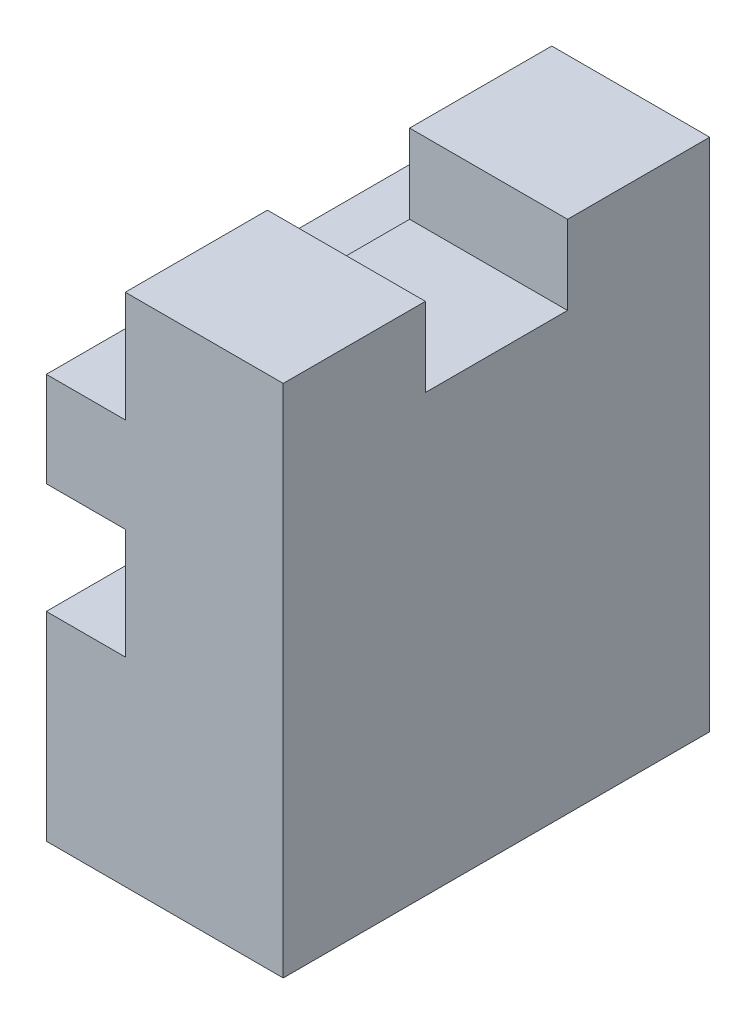
ISO-10303-21;
HEADER;
FILE_DESCRIPTION(('STEP AP214'),'2;1');
FILE_NAME('part.step','',(''),(''),'','','');
FILE_SCHEMA(('AUTOMOTIVE_DESIGN { 1 0 10303 214 1 1 1 1 }'));
ENDSEC;
DATA;
#1=APPLICATION_CONTEXT('core data for automotive mechanical design processes');
#2=APPLICATION_PROTOCOL_DEFINITION('international standard','automotive_design',2000,#1);
#3=PRODUCT_CONTEXT('',#1,'mechanical');
#4=PRODUCT('Part','Part','',(#3));
#5=PRODUCT_RELATED_PRODUCT_CATEGORY('part','',(#4));
#6=PRODUCT_DEFINITION_FORMATION('','',#4);
#7=PRODUCT_DEFINITION_CONTEXT('part definition',#1,'design');
#8=PRODUCT_DEFINITION('design','',#6,#7);
#9=PRODUCT_DEFINITION_SHAPE('','',#8);
#10=(LENGTH_UNIT() NAMED_UNIT(*) SI_UNIT(.MILLI.,.METRE.));
#11=(NAMED_UNIT(*) PLANE_ANGLE_UNIT() SI_UNIT($,.RADIAN.));
#12=(NAMED_UNIT(*) SI_UNIT($,.STERADIAN.) SOLID_ANGLE_UNIT());
#13=UNCERTAINTY_MEASURE_WITH_UNIT(LENGTH_MEASURE(1.E-05),#10,'distance_accuracy_value','');
#14=(GEOMETRIC_REPRESENTATION_CONTEXT(3) GLOBAL_UNCERTAINTY_ASSIGNED_CONTEXT((#13)) GLOBAL_UNIT_ASSIGNED_CONTEXT((#10,
#11,#12)) REPRESENTATION_CONTEXT('',''));
#15=CARTESIAN_POINT('',(0.,0.,0.));
#16=DIRECTION('',(0.,0.,1.));
#17=DIRECTION('',(1.,0.,0.));
#18=AXIS2_PLACEMENT_3D('',#15,#16,#17);
#19=CARTESIAN_POINT('',(0.,0.,27.));
#20=DIRECTION('',(0.,-1.,0.));
#21=DIRECTION('',(1.,0.,0.));
#22=AXIS2_PLACEMENT_3D('',#19,#20,#21);
#23=PLANE('',#22);
#24=DIRECTION('',(0.,0.,-1.));
#25=VECTOR('',#24,1.);
#26=CARTESIAN_POINT('',(0.,0.,27.));
#27=LINE('',#26,#25);
#28=CARTESIAN_POINT('',(0.,0.,9.));
#29=VERTEX_POINT('',#28);
#30=CARTESIAN_POINT('',(0.,0.,0.));
#31=VERTEX_POINT('',#30);
#32=EDGE_CURVE('E105',#29,#31,#27,.T.);
#33=ORIENTED_EDGE('',*,*,#32,.F.);
#34=DIRECTION('',(-1.,0.,0.));
#35=VECTOR('',#34,1.);
#36=CARTESIAN_POINT('',(0.,0.,9.));
#37=LINE('',#36,#35);
#38=CARTESIAN_POINT('',(10.,0.,9.));
#39=VERTEX_POINT('',#38);
#40=EDGE_CURVE('E244',#39,#29,#37,.T.);
#41=ORIENTED_EDGE('',*,*,#40,.F.);
#42=DIRECTION('',(0.,0.,-1.));
#43=VECTOR('',#42,1.);
#44=CARTESIAN_POINT('',(10.,0.,27.));
#45=LINE('',#44,#43);
#46=CARTESIAN_POINT('',(10.,0.,0.));
#47=VERTEX_POINT('',#46);
#48=EDGE_CURVE('E190',#39,#47,#45,.T.);
#49=ORIENTED_EDGE('',*,*,#48,.T.);
#50=DIRECTION('',(-1.,0.,0.));
#51=VECTOR('',#50,1.);
#52=CARTESIAN_POINT('',(0.,0.,0.));
#53=LINE('',#52,#51);
#54=EDGE_CURVE('E184',#47,#31,#53,.T.);
#55=ORIENTED_EDGE('',*,*,#54,.T.);
#56=EDGE_LOOP('',(#33,#41,#49,#55));
#57=FACE_BOUND('',#56,.T.);
#58=ADVANCED_FACE('F41',(#57),#23,.F.);
#59=CARTESIAN_POINT('',(0.,-7.,27.));
#60=DIRECTION('',(1.,0.,0.));
#61=DIRECTION('',(0.,0.,-1.));
#62=AXIS2_PLACEMENT_3D('',#59,#60,#61);
#63=PLANE('',#62);
#64=DIRECTION('',(0.,0.,1.));
#65=VECTOR('',#64,1.);
#66=CARTESIAN_POINT('',(0.,-5.,9.));
#67=LINE('',#66,#65);
#68=CARTESIAN_POINT('',(0.,-5.,9.));
#69=VERTEX_POINT('',#68);
#70=CARTESIAN_POINT('',(0.,-5.,18.));
#71=VERTEX_POINT('',#70);
#72=EDGE_CURVE('E247',#69,#71,#67,.T.);
#73=ORIENTED_EDGE('',*,*,#72,.F.);
#74=DIRECTION('',(0.,1.,0.));
#75=VECTOR('',#74,1.);
#76=CARTESIAN_POINT('',(0.,-5.,9.));
#77=LINE('',#76,#75);
#78=EDGE_CURVE('E169',#69,#29,#77,.T.);
#79=ORIENTED_EDGE('',*,*,#78,.T.);
#80=ORIENTED_EDGE('',*,*,#32,.T.);
#81=DIRECTION('',(0.,-1.,0.));
#82=VECTOR('',#81,1.);
#83=CARTESIAN_POINT('',(0.,-7.,0.));
#84=LINE('',#83,#82);
#85=CARTESIAN_POINT('',(0.,-7.,0.));
#86=VERTEX_POINT('',#85);
#87=EDGE_CURVE('E166',#31,#86,#84,.T.);
#88=ORIENTED_EDGE('',*,*,#87,.T.);
#89=DIRECTION('',(0.,0.,-1.));
#90=VECTOR('',#89,1.);
#91=CARTESIAN_POINT('',(0.,-7.,27.));
#92=LINE('',#91,#90);
#93=CARTESIAN_POINT('',(0.,-7.,27.));
#94=VERTEX_POINT('',#93);
#95=EDGE_CURVE('E11',#94,#86,#92,.T.);
#96=ORIENTED_EDGE('',*,*,#95,.F.);
#97=DIRECTION('',(0.,-1.,0.));
#98=VECTOR('',#97,1.);
#99=CARTESIAN_POINT('',(0.,-7.,27.));
#100=LINE('',#99,#98);
#101=CARTESIAN_POINT('',(0.,0.,27.));
#102=VERTEX_POINT('',#101);
#103=EDGE_CURVE('E186',#102,#94,#100,.T.);
#104=ORIENTED_EDGE('',*,*,#103,.F.);
#105=CARTESIAN_POINT('',(0.,0.,18.));
#106=VERTEX_POINT('',#105);
#107=EDGE_CURVE('E187',#102,#106,#27,.T.);
#108=ORIENTED_EDGE('',*,*,#107,.T.);
#109=DIRECTION('',(0.,1.,0.));
#110=VECTOR('',#109,1.);
#111=CARTESIAN_POINT('',(0.,-5.,18.));
#112=LINE('',#111,#110);
#113=EDGE_CURVE('E56',#71,#106,#112,.T.);
#114=ORIENTED_EDGE('',*,*,#113,.F.);
#115=EDGE_LOOP('',(#73,#79,#80,#88,#96,#104,#108,#114));
#116=FACE_BOUND('',#115,.T.);
#117=ADVANCED_FACE('F43',(#116),#63,.F.);
#118=CARTESIAN_POINT('',(-5.,-7.,27.));
#119=DIRECTION('',(0.,-1.,0.));
#120=DIRECTION('',(1.,0.,0.));
#121=AXIS2_PLACEMENT_3D('',#118,#119,#120);
#122=PLANE('',#121);
#123=DIRECTION('',(-1.,0.,0.));
#124=VECTOR('',#123,1.);
#125=CARTESIAN_POINT('',(-5.,-7.,0.));
#126=LINE('',#125,#124);
#127=CARTESIAN_POINT('',(-5.,-7.,0.));
#128=VERTEX_POINT('',#127);
#129=EDGE_CURVE('E168',#86,#128,#126,.T.);
#130=ORIENTED_EDGE('',*,*,#129,.T.);
#131=DIRECTION('',(0.,0.,-1.));
#132=VECTOR('',#131,1.);
#133=CARTESIAN_POINT('',(-5.,-7.,27.));
#134=LINE('',#133,#132);
#135=CARTESIAN_POINT('',(-5.,-7.,27.));
#136=VERTEX_POINT('',#135);
#137=EDGE_CURVE('E49',#136,#128,#134,.T.);
#138=ORIENTED_EDGE('',*,*,#137,.F.);
#139=DIRECTION('',(-1.,0.,0.));
#140=VECTOR('',#139,1.);
#141=CARTESIAN_POINT('',(-5.,-7.,27.));
#142=LINE('',#141,#140);
#143=EDGE_CURVE('E113',#94,#136,#142,.T.);
#144=ORIENTED_EDGE('',*,*,#143,.F.);
#145=ORIENTED_EDGE('',*,*,#95,.T.);
#146=EDGE_LOOP('',(#130,#138,#144,#145));
#147=FACE_BOUND('',#146,.T.);
#148=ADVANCED_FACE('F287',(#147),#122,.F.);
#149=CARTESIAN_POINT('',(-5.,-13.,27.));
#150=DIRECTION('',(1.,0.,0.));
#151=DIRECTION('',(0.,0.,-1.));
#152=AXIS2_PLACEMENT_3D('',#149,#150,#151);
#153=PLANE('',#152);
#154=DIRECTION('',(0.,-1.,0.));
#155=VECTOR('',#154,1.);
#156=CARTESIAN_POINT('',(-5.,-13.,0.));
#157=LINE('',#156,#155);
#158=CARTESIAN_POINT('',(-5.,-13.,0.));
#159=VERTEX_POINT('',#158);
#160=EDGE_CURVE('E171',#128,#159,#157,.T.);
#161=ORIENTED_EDGE('',*,*,#160,.T.);
#162=DIRECTION('',(0.,0.,-1.));
#163=VECTOR('',#162,1.);
#164=CARTESIAN_POINT('',(-5.,-13.,27.));
#165=LINE('',#164,#163);
#166=CARTESIAN_POINT('',(-5.,-13.,27.));
#167=VERTEX_POINT('',#166);
#168=EDGE_CURVE('E202',#167,#159,#165,.T.);
#169=ORIENTED_EDGE('',*,*,#168,.F.);
#170=DIRECTION('',(0.,-1.,0.));
#171=VECTOR('',#170,1.);
#172=CARTESIAN_POINT('',(-5.,-13.,27.));
#173=LINE('',#172,#171);
#174=EDGE_CURVE('E210',#136,#167,#173,.T.);
#175=ORIENTED_EDGE('',*,*,#174,.F.);
#176=ORIENTED_EDGE('',*,*,#137,.T.);
#177=EDGE_LOOP('',(#161,#169,#175,#176));
#178=FACE_BOUND('',#177,.T.);
#179=ADVANCED_FACE('F208',(#178),#153,.F.);
#180=CARTESIAN_POINT('',(0.,-13.,27.));
#181=DIRECTION('',(0.,1.,0.));
#182=DIRECTION('',(0.,0.,1.));
#183=AXIS2_PLACEMENT_3D('',#180,#181,#182);
#184=PLANE('',#183);
#185=DIRECTION('',(1.,0.,0.));
#186=VECTOR('',#185,1.);
#187=CARTESIAN_POINT('',(0.,-13.,0.));
#188=LINE('',#187,#186);
#189=CARTESIAN_POINT('',(0.,-13.,0.));
#190=VERTEX_POINT('',#189);
#191=EDGE_CURVE('E173',#159,#190,#188,.T.);
#192=ORIENTED_EDGE('',*,*,#191,.T.);
#193=DIRECTION('',(0.,0.,-1.));
#194=VECTOR('',#193,1.);
#195=CARTESIAN_POINT('',(0.,-13.,27.));
#196=LINE('',#195,#194);
#197=CARTESIAN_POINT('',(0.,-13.,27.));
#198=VERTEX_POINT('',#197);
#199=EDGE_CURVE('E199',#198,#190,#196,.T.);
#200=ORIENTED_EDGE('',*,*,#199,.F.);
#201=DIRECTION('',(1.,0.,0.));
#202=VECTOR('',#201,1.);
#203=CARTESIAN_POINT('',(0.,-13.,27.));
#204=LINE('',#203,#202);
#205=EDGE_CURVE('E228',#167,#198,#204,.T.);
#206=ORIENTED_EDGE('',*,*,#205,.F.);
#207=ORIENTED_EDGE('',*,*,#168,.T.);
#208=EDGE_LOOP('',(#192,#200,#206,#207));
#209=FACE_BOUND('',#208,.T.);
#210=ADVANCED_FACE('F219',(#209),#184,.F.);
#211=CARTESIAN_POINT('',(0.,-20.,27.));
#212=DIRECTION('',(1.,0.,0.));
#213=DIRECTION('',(0.,1.,0.));
#214=AXIS2_PLACEMENT_3D('',#211,#212,#213);
#215=PLANE('',#214);
#216=DIRECTION('',(0.,-1.,0.));
#217=VECTOR('',#216,1.);
#218=CARTESIAN_POINT('',(0.,-20.,0.));
#219=LINE('',#218,#217);
#220=CARTESIAN_POINT('',(0.,-20.,0.));
#221=VERTEX_POINT('',#220);
#222=EDGE_CURVE('E175',#190,#221,#219,.T.);
#223=ORIENTED_EDGE('',*,*,#222,.T.);
#224=DIRECTION('',(0.,0.,-1.));
#225=VECTOR('',#224,1.);
#226=CARTESIAN_POINT('',(0.,-20.,27.));
#227=LINE('',#226,#225);
#228=CARTESIAN_POINT('',(0.,-20.,27.));
#229=VERTEX_POINT('',#228);
#230=EDGE_CURVE('E196',#229,#221,#227,.T.);
#231=ORIENTED_EDGE('',*,*,#230,.F.);
#232=DIRECTION('',(0.,-1.,0.));
#233=VECTOR('',#232,1.);
#234=CARTESIAN_POINT('',(0.,-20.,27.));
#235=LINE('',#234,#233);
#236=EDGE_CURVE('E225',#198,#229,#235,.T.);
#237=ORIENTED_EDGE('',*,*,#236,.F.);
#238=ORIENTED_EDGE('',*,*,#199,.T.);
#239=EDGE_LOOP('',(#223,#231,#237,#238));
#240=FACE_BOUND('',#239,.T.);
#241=ADVANCED_FACE('F223',(#240),#215,.F.);
#242=CARTESIAN_POINT('',(-5.,-20.,27.));
#243=DIRECTION('',(0.,-1.,0.));
#244=DIRECTION('',(0.,0.,-1.));
#245=AXIS2_PLACEMENT_3D('',#242,#243,#244);
#246=PLANE('',#245);
#247=DIRECTION('',(-1.,0.,0.));
#248=VECTOR('',#247,1.);
#249=CARTESIAN_POINT('',(-5.,-20.,0.));
#250=LINE('',#249,#248);
#251=CARTESIAN_POINT('',(-5.,-20.,0.));
#252=VERTEX_POINT('',#251);
#253=EDGE_CURVE('E177',#221,#252,#250,.T.);
#254=ORIENTED_EDGE('',*,*,#253,.T.);
#255=DIRECTION('',(0.,0.,-1.));
#256=VECTOR('',#255,1.);
#257=CARTESIAN_POINT('',(-5.,-20.,27.));
#258=LINE('',#257,#256);
#259=CARTESIAN_POINT('',(-5.,-20.,27.));
#260=VERTEX_POINT('',#259);
#261=EDGE_CURVE('E193',#260,#252,#258,.T.);
#262=ORIENTED_EDGE('',*,*,#261,.F.);
#263=DIRECTION('',(-1.,0.,0.));
#264=VECTOR('',#263,1.);
#265=CARTESIAN_POINT('',(-5.,-20.,27.));
#266=LINE('',#265,#264);
#267=EDGE_CURVE('E227',#229,#260,#266,.T.);
#268=ORIENTED_EDGE('',*,*,#267,.F.);
#269=ORIENTED_EDGE('',*,*,#230,.T.);
#270=EDGE_LOOP('',(#254,#262,#268,#269));
#271=FACE_BOUND('',#270,.T.);
#272=ADVANCED_FACE('F316',(#271),#246,.F.);
#273=CARTESIAN_POINT('',(-5.,-32.6,27.));
#274=DIRECTION('',(1.,0.,0.));
#275=DIRECTION('',(0.,0.,-1.));
#276=AXIS2_PLACEMENT_3D('',#273,#274,#275);
#277=PLANE('',#276);
#278=DIRECTION('',(0.,-1.,0.));
#279=VECTOR('',#278,1.);
#280=CARTESIAN_POINT('',(-5.,-32.6,0.));
#281=LINE('',#280,#279);
#282=CARTESIAN_POINT('',(-5.,-32.6,0.));
#283=VERTEX_POINT('',#282);
#284=EDGE_CURVE('E179',#252,#283,#281,.T.);
#285=ORIENTED_EDGE('',*,*,#284,.T.);
#286=DIRECTION('',(0.,0.,-1.));
#287=VECTOR('',#286,1.);
#288=CARTESIAN_POINT('',(-5.,-32.6,27.));
#289=LINE('',#288,#287);
#290=CARTESIAN_POINT('',(-5.,-32.6,27.));
#291=VERTEX_POINT('',#290);
#292=EDGE_CURVE('E155',#291,#283,#289,.T.);
#293=ORIENTED_EDGE('',*,*,#292,.F.);
#294=DIRECTION('',(0.,-1.,0.));
#295=VECTOR('',#294,1.);
#296=CARTESIAN_POINT('',(-5.,-32.6,27.));
#297=LINE('',#296,#295);
#298=EDGE_CURVE('E142',#260,#291,#297,.T.);
#299=ORIENTED_EDGE('',*,*,#298,.F.);
#300=ORIENTED_EDGE('',*,*,#261,.T.);
#301=EDGE_LOOP('',(#285,#293,#299,#300));
#302=FACE_BOUND('',#301,.T.);
#303=ADVANCED_FACE('F311',(#302),#277,.F.);
#304=CARTESIAN_POINT('',(10.,-32.6,27.));
#305=DIRECTION('',(0.,1.,0.));
#306=DIRECTION('',(0.,0.,1.));
#307=AXIS2_PLACEMENT_3D('',#304,#305,#306);
#308=PLANE('',#307);
#309=DIRECTION('',(1.,0.,0.));
#310=VECTOR('',#309,1.);
#311=CARTESIAN_POINT('',(10.,-32.6,0.));
#312=LINE('',#311,#310);
#313=CARTESIAN_POINT('',(10.,-32.6,0.));
#314=VERTEX_POINT('',#313);
#315=EDGE_CURVE('E151',#283,#314,#312,.T.);
#316=ORIENTED_EDGE('',*,*,#315,.T.);
#317=DIRECTION('',(0.,0.,-1.));
#318=VECTOR('',#317,1.);
#319=CARTESIAN_POINT('',(10.,-32.6,27.));
#320=LINE('',#319,#318);
#321=CARTESIAN_POINT('',(10.,-32.6,27.));
#322=VERTEX_POINT('',#321);
#323=EDGE_CURVE('E148',#322,#314,#320,.T.);
#324=ORIENTED_EDGE('',*,*,#323,.F.);
#325=DIRECTION('',(1.,0.,0.));
#326=VECTOR('',#325,1.);
#327=CARTESIAN_POINT('',(10.,-32.6,27.));
#328=LINE('',#327,#326);
#329=EDGE_CURVE('E135',#291,#322,#328,.T.);
#330=ORIENTED_EDGE('',*,*,#329,.F.);
#331=ORIENTED_EDGE('',*,*,#292,.T.);
#332=EDGE_LOOP('',(#316,#324,#330,#331));
#333=FACE_BOUND('',#332,.T.);
#334=ADVANCED_FACE('F149',(#333),#308,.F.);
#335=CARTESIAN_POINT('',(10.,0.,27.));
#336=DIRECTION('',(-1.,0.,0.));
#337=DIRECTION('',(0.,-1.,0.));
#338=AXIS2_PLACEMENT_3D('',#335,#336,#337);
#339=PLANE('',#338);
#340=ORIENTED_EDGE('',*,*,#48,.F.);
#341=DIRECTION('',(0.,1.,0.));
#342=VECTOR('',#341,1.);
#343=CARTESIAN_POINT('',(10.,-5.,9.));
#344=LINE('',#343,#342);
#345=CARTESIAN_POINT('',(10.,-5.,9.));
#346=VERTEX_POINT('',#345);
#347=EDGE_CURVE('E240',#346,#39,#344,.T.);
#348=ORIENTED_EDGE('',*,*,#347,.F.);
#349=DIRECTION('',(0.,0.,-1.));
#350=VECTOR('',#349,1.);
#351=CARTESIAN_POINT('',(10.,-5.,9.));
#352=LINE('',#351,#350);
#353=CARTESIAN_POINT('',(10.,-5.,18.));
#354=VERTEX_POINT('',#353);
#355=EDGE_CURVE('E252',#354,#346,#352,.T.);
#356=ORIENTED_EDGE('',*,*,#355,.F.);
#357=DIRECTION('',(0.,1.,0.));
#358=VECTOR('',#357,1.);
#359=CARTESIAN_POINT('',(10.,-5.,18.));
#360=LINE('',#359,#358);
#361=CARTESIAN_POINT('',(10.,0.,18.));
#362=VERTEX_POINT('',#361);
#363=EDGE_CURVE('E237',#354,#362,#360,.T.);
#364=ORIENTED_EDGE('',*,*,#363,.T.);
#365=CARTESIAN_POINT('',(10.,0.,27.));
#366=VERTEX_POINT('',#365);
#367=EDGE_CURVE('E156',#366,#362,#45,.T.);
#368=ORIENTED_EDGE('',*,*,#367,.F.);
#369=DIRECTION('',(0.,1.,0.));
#370=VECTOR('',#369,1.);
#371=CARTESIAN_POINT('',(10.,0.,27.));
#372=LINE('',#371,#370);
#373=EDGE_CURVE('E139',#322,#366,#372,.T.);
#374=ORIENTED_EDGE('',*,*,#373,.F.);
#375=ORIENTED_EDGE('',*,*,#323,.T.);
#376=DIRECTION('',(0.,1.,0.));
#377=VECTOR('',#376,1.);
#378=CARTESIAN_POINT('',(10.,0.,0.));
#379=LINE('',#378,#377);
#380=EDGE_CURVE('E182',#314,#47,#379,.T.);
#381=ORIENTED_EDGE('',*,*,#380,.T.);
#382=EDGE_LOOP('',(#340,#348,#356,#364,#368,#374,#375,#381));
#383=FACE_BOUND('',#382,.T.);
#384=ADVANCED_FACE('F159',(#383),#339,.F.);
#385=ORIENTED_EDGE('',*,*,#367,.T.);
#386=DIRECTION('',(1.,0.,0.));
#387=VECTOR('',#386,1.);
#388=CARTESIAN_POINT('',(0.,0.,18.));
#389=LINE('',#388,#387);
#390=EDGE_CURVE('E248',#106,#362,#389,.T.);
#391=ORIENTED_EDGE('',*,*,#390,.F.);
#392=ORIENTED_EDGE('',*,*,#107,.F.);
#393=DIRECTION('',(-1.,0.,0.));
#394=VECTOR('',#393,1.);
#395=CARTESIAN_POINT('',(0.,0.,27.));
#396=LINE('',#395,#394);
#397=EDGE_CURVE('E65',#366,#102,#396,.T.);
#398=ORIENTED_EDGE('',*,*,#397,.F.);
#399=EDGE_LOOP('',(#385,#391,#392,#398));
#400=FACE_BOUND('',#399,.T.);
#401=ADVANCED_FACE('F270',(#400),#23,.F.);
#402=CARTESIAN_POINT('',(0.,0.,27.));
#403=DIRECTION('',(0.,0.,-1.));
#404=DIRECTION('',(-1.,0.,0.));
#405=AXIS2_PLACEMENT_3D('',#402,#403,#404);
#406=PLANE('',#405);
#407=ORIENTED_EDGE('',*,*,#103,.T.);
#408=ORIENTED_EDGE('',*,*,#143,.T.);
#409=ORIENTED_EDGE('',*,*,#174,.T.);
#410=ORIENTED_EDGE('',*,*,#205,.T.);
#411=ORIENTED_EDGE('',*,*,#236,.T.);
#412=ORIENTED_EDGE('',*,*,#267,.T.);
#413=ORIENTED_EDGE('',*,*,#298,.T.);
#414=ORIENTED_EDGE('',*,*,#329,.T.);
#415=ORIENTED_EDGE('',*,*,#373,.T.);
#416=ORIENTED_EDGE('',*,*,#397,.T.);
#417=EDGE_LOOP('',(#407,#408,#409,#410,#411,#412,#413,#414,#415,#416));
#418=FACE_BOUND('',#417,.T.);
#419=ADVANCED_FACE('F137',(#418),#406,.F.);
#420=CARTESIAN_POINT('',(0.,0.,0.));
#421=DIRECTION('',(0.,0.,-1.));
#422=DIRECTION('',(-1.,0.,0.));
#423=AXIS2_PLACEMENT_3D('',#420,#421,#422);
#424=PLANE('',#423);
#425=ORIENTED_EDGE('',*,*,#87,.F.);
#426=ORIENTED_EDGE('',*,*,#54,.F.);
#427=ORIENTED_EDGE('',*,*,#380,.F.);
#428=ORIENTED_EDGE('',*,*,#315,.F.);
#429=ORIENTED_EDGE('',*,*,#284,.F.);
#430=ORIENTED_EDGE('',*,*,#253,.F.);
#431=ORIENTED_EDGE('',*,*,#222,.F.);
#432=ORIENTED_EDGE('',*,*,#191,.F.);
#433=ORIENTED_EDGE('',*,*,#160,.F.);
#434=ORIENTED_EDGE('',*,*,#129,.F.);
#435=EDGE_LOOP('',(#425,#426,#427,#428,#429,#430,#431,#432,#433,#434));
#436=FACE_BOUND('',#435,.T.);
#437=ADVANCED_FACE('F214',(#436),#424,.T.);
#438=CARTESIAN_POINT('',(0.,-5.,9.));
#439=DIRECTION('',(0.,0.,-1.));
#440=DIRECTION('',(-1.,0.,0.));
#441=AXIS2_PLACEMENT_3D('',#438,#439,#440);
#442=PLANE('',#441);
#443=ORIENTED_EDGE('',*,*,#40,.T.);
#444=ORIENTED_EDGE('',*,*,#78,.F.);
#445=DIRECTION('',(-1.,0.,0.));
#446=VECTOR('',#445,1.);
#447=CARTESIAN_POINT('',(0.,-5.,9.));
#448=LINE('',#447,#446);
#449=EDGE_CURVE('E238',#346,#69,#448,.T.);
#450=ORIENTED_EDGE('',*,*,#449,.F.);
#451=ORIENTED_EDGE('',*,*,#347,.T.);
#452=EDGE_LOOP('',(#443,#444,#450,#451));
#453=FACE_BOUND('',#452,.T.);
#454=ADVANCED_FACE('F282',(#453),#442,.F.);
#455=CARTESIAN_POINT('',(0.,-5.,18.));
#456=DIRECTION('',(0.,0.,1.));
#457=DIRECTION('',(1.,0.,0.));
#458=AXIS2_PLACEMENT_3D('',#455,#456,#457);
#459=PLANE('',#458);
#460=ORIENTED_EDGE('',*,*,#390,.T.);
#461=ORIENTED_EDGE('',*,*,#363,.F.);
#462=DIRECTION('',(1.,0.,0.));
#463=VECTOR('',#462,1.);
#464=CARTESIAN_POINT('',(0.,-5.,18.));
#465=LINE('',#464,#463);
#466=EDGE_CURVE('E255',#71,#354,#465,.T.);
#467=ORIENTED_EDGE('',*,*,#466,.F.);
#468=ORIENTED_EDGE('',*,*,#113,.T.);
#469=EDGE_LOOP('',(#460,#461,#467,#468));
#470=FACE_BOUND('',#469,.T.);
#471=ADVANCED_FACE('F273',(#470),#459,.F.);
#472=CARTESIAN_POINT('',(0.,-5.,0.));
#473=DIRECTION('',(0.,1.,0.));
#474=DIRECTION('',(-1.,0.,0.));
#475=AXIS2_PLACEMENT_3D('',#472,#473,#474);
#476=PLANE('',#475);
#477=ORIENTED_EDGE('',*,*,#72,.T.);
#478=ORIENTED_EDGE('',*,*,#466,.T.);
#479=ORIENTED_EDGE('',*,*,#355,.T.);
#480=ORIENTED_EDGE('',*,*,#449,.T.);
#481=EDGE_LOOP('',(#477,#478,#479,#480));
#482=FACE_BOUND('',#481,.T.);
#483=ADVANCED_FACE('F262',(#482),#476,.T.);
#484=CLOSED_SHELL('',(#58,#117,#148,#179,#210,#241,#272,#303,#334,#384,#401,#419,#437,#454,#471,#483));
#485=MANIFOLD_SOLID_BREP('B2',#484);
#486=ADVANCED_BREP_SHAPE_REPRESENTATION('',(#18,#485),#14);
#487=SHAPE_DEFINITION_REPRESENTATION(#9,#486);
ENDSEC;
END-ISO-10303-21;
